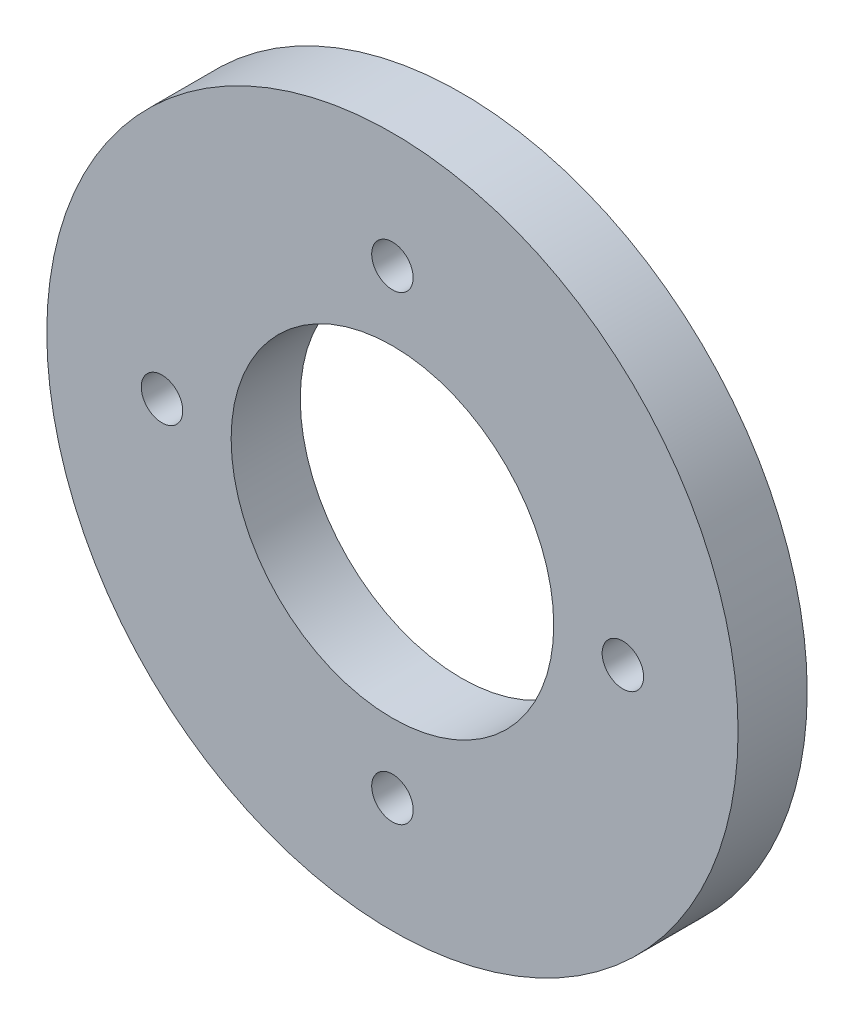
ISO-10303-21;
HEADER;
FILE_DESCRIPTION(('STEP AP214'),'2;1');
FILE_NAME('part.step','',(''),(''),'','','');
FILE_SCHEMA(('AUTOMOTIVE_DESIGN { 1 0 10303 214 1 1 1 1 }'));
ENDSEC;
DATA;
#1=APPLICATION_CONTEXT('core data for automotive mechanical design processes');
#2=APPLICATION_PROTOCOL_DEFINITION('international standard','automotive_design',2000,#1);
#3=PRODUCT_CONTEXT('',#1,'mechanical');
#4=PRODUCT('Part','Part','',(#3));
#5=PRODUCT_RELATED_PRODUCT_CATEGORY('part','',(#4));
#6=PRODUCT_DEFINITION_FORMATION('','',#4);
#7=PRODUCT_DEFINITION_CONTEXT('part definition',#1,'design');
#8=PRODUCT_DEFINITION('design','',#6,#7);
#9=PRODUCT_DEFINITION_SHAPE('','',#8);
#10=(LENGTH_UNIT() NAMED_UNIT(*) SI_UNIT(.MILLI.,.METRE.));
#11=(NAMED_UNIT(*) PLANE_ANGLE_UNIT() SI_UNIT($,.RADIAN.));
#12=(NAMED_UNIT(*) SI_UNIT($,.STERADIAN.) SOLID_ANGLE_UNIT());
#13=UNCERTAINTY_MEASURE_WITH_UNIT(LENGTH_MEASURE(1.E-05),#10,'distance_accuracy_value','');
#14=(GEOMETRIC_REPRESENTATION_CONTEXT(3) GLOBAL_UNCERTAINTY_ASSIGNED_CONTEXT((#13)) GLOBAL_UNIT_ASSIGNED_CONTEXT((#10,
#11,#12)) REPRESENTATION_CONTEXT('',''));
#15=CARTESIAN_POINT('',(0.,0.,0.));
#16=DIRECTION('',(0.,0.,1.));
#17=DIRECTION('',(1.,0.,0.));
#18=AXIS2_PLACEMENT_3D('',#15,#16,#17);
#19=CARTESIAN_POINT('',(0.,0.,3.));
#20=DIRECTION('',(0.,0.,1.));
#21=DIRECTION('',(1.,0.,0.));
#22=AXIS2_PLACEMENT_3D('',#19,#20,#21);
#23=PLANE('',#22);
#24=CARTESIAN_POINT('',(0.,0.,3.));
#25=DIRECTION('',(0.,0.,1.));
#26=DIRECTION('',(1.,0.,0.));
#27=AXIS2_PLACEMENT_3D('',#24,#25,#26);
#28=CIRCLE('',#27,7.);
#29=CARTESIAN_POINT('',(7.,0.,3.));
#30=VERTEX_POINT('',#29);
#31=EDGE_CURVE('E65',#30,#30,#28,.T.);
#32=ORIENTED_EDGE('',*,*,#31,.F.);
#33=EDGE_LOOP('',(#32));
#34=FACE_BOUND('',#33,.T.);
#35=CARTESIAN_POINT('',(0.,10.,3.));
#36=DIRECTION('',(0.,0.,1.));
#37=DIRECTION('',(1.,0.,0.));
#38=AXIS2_PLACEMENT_3D('',#35,#36,#37);
#39=CIRCLE('',#38,0.9);
#40=CARTESIAN_POINT('',(0.900000000000069,10.,3.));
#41=VERTEX_POINT('',#40);
#42=EDGE_CURVE('E53',#41,#41,#39,.T.);
#43=ORIENTED_EDGE('',*,*,#42,.F.);
#44=EDGE_LOOP('',(#43));
#45=FACE_BOUND('',#44,.T.);
#46=CARTESIAN_POINT('',(0.,-10.,3.));
#47=DIRECTION('',(0.,0.,1.));
#48=DIRECTION('',(1.,0.,0.));
#49=AXIS2_PLACEMENT_3D('',#46,#47,#48);
#50=CIRCLE('',#49,0.9);
#51=CARTESIAN_POINT('',(0.900000000000001,-10.,3.));
#52=VERTEX_POINT('',#51);
#53=EDGE_CURVE('E42',#52,#52,#50,.T.);
#54=ORIENTED_EDGE('',*,*,#53,.F.);
#55=EDGE_LOOP('',(#54));
#56=FACE_BOUND('',#55,.T.);
#57=CARTESIAN_POINT('',(0.,0.,3.));
#58=DIRECTION('',(0.,0.,1.));
#59=DIRECTION('',(1.,0.,0.));
#60=AXIS2_PLACEMENT_3D('',#57,#58,#59);
#61=CIRCLE('',#60,15.);
#62=CARTESIAN_POINT('',(15.,0.,3.));
#63=VERTEX_POINT('',#62);
#64=EDGE_CURVE('E10',#63,#63,#61,.T.);
#65=ORIENTED_EDGE('',*,*,#64,.T.);
#66=EDGE_LOOP('',(#65));
#67=FACE_BOUND('',#66,.T.);
#68=CARTESIAN_POINT('',(-10.,0.,3.));
#69=DIRECTION('',(0.,0.,1.));
#70=DIRECTION('',(1.,0.,0.));
#71=AXIS2_PLACEMENT_3D('',#68,#69,#70);
#72=CIRCLE('',#71,0.9);
#73=CARTESIAN_POINT('',(-9.1,0.,3.));
#74=VERTEX_POINT('',#73);
#75=EDGE_CURVE('E47',#74,#74,#72,.T.);
#76=ORIENTED_EDGE('',*,*,#75,.F.);
#77=EDGE_LOOP('',(#76));
#78=FACE_BOUND('',#77,.T.);
#79=CARTESIAN_POINT('',(10.,-1.05254516842123E-13,3.));
#80=DIRECTION('',(0.,0.,1.));
#81=DIRECTION('',(1.,0.,0.));
#82=AXIS2_PLACEMENT_3D('',#79,#80,#81);
#83=CIRCLE('',#82,0.9);
#84=CARTESIAN_POINT('',(10.9,-1.05254516842123E-13,3.));
#85=VERTEX_POINT('',#84);
#86=EDGE_CURVE('E59',#85,#85,#83,.T.);
#87=ORIENTED_EDGE('',*,*,#86,.F.);
#88=EDGE_LOOP('',(#87));
#89=FACE_BOUND('',#88,.T.);
#90=ADVANCED_FACE('F31',(#34,#45,#56,#67,#78,#89),#23,.T.);
#91=CARTESIAN_POINT('',(0.,0.,0.));
#92=DIRECTION('',(0.,0.,1.));
#93=DIRECTION('',(1.,0.,0.));
#94=AXIS2_PLACEMENT_3D('',#91,#92,#93);
#95=PLANE('',#94);
#96=CARTESIAN_POINT('',(0.,0.,0.));
#97=DIRECTION('',(0.,0.,-1.));
#98=DIRECTION('',(-1.,0.,0.));
#99=AXIS2_PLACEMENT_3D('',#96,#97,#98);
#100=CIRCLE('',#99,7.);
#101=CARTESIAN_POINT('',(-7.,0.,0.));
#102=VERTEX_POINT('',#101);
#103=EDGE_CURVE('E70',#102,#102,#100,.T.);
#104=ORIENTED_EDGE('',*,*,#103,.F.);
#105=EDGE_LOOP('',(#104));
#106=FACE_BOUND('',#105,.T.);
#107=CARTESIAN_POINT('',(0.,0.,0.));
#108=DIRECTION('',(0.,0.,1.));
#109=DIRECTION('',(1.,0.,0.));
#110=AXIS2_PLACEMENT_3D('',#107,#108,#109);
#111=CIRCLE('',#110,15.);
#112=CARTESIAN_POINT('',(15.,0.,0.));
#113=VERTEX_POINT('',#112);
#114=EDGE_CURVE('E35',#113,#113,#111,.T.);
#115=ORIENTED_EDGE('',*,*,#114,.F.);
#116=EDGE_LOOP('',(#115));
#117=FACE_BOUND('',#116,.T.);
#118=CARTESIAN_POINT('',(0.,-10.,0.));
#119=DIRECTION('',(0.,0.,1.));
#120=DIRECTION('',(1.,0.,0.));
#121=AXIS2_PLACEMENT_3D('',#118,#119,#120);
#122=CIRCLE('',#121,0.9);
#123=CARTESIAN_POINT('',(0.900000000000001,-10.,0.));
#124=VERTEX_POINT('',#123);
#125=EDGE_CURVE('E44',#124,#124,#122,.T.);
#126=ORIENTED_EDGE('',*,*,#125,.T.);
#127=EDGE_LOOP('',(#126));
#128=FACE_BOUND('',#127,.T.);
#129=CARTESIAN_POINT('',(-10.,0.,0.));
#130=DIRECTION('',(0.,0.,1.));
#131=DIRECTION('',(1.,0.,0.));
#132=AXIS2_PLACEMENT_3D('',#129,#130,#131);
#133=CIRCLE('',#132,0.9);
#134=CARTESIAN_POINT('',(-9.1,0.,0.));
#135=VERTEX_POINT('',#134);
#136=EDGE_CURVE('E50',#135,#135,#133,.T.);
#137=ORIENTED_EDGE('',*,*,#136,.T.);
#138=EDGE_LOOP('',(#137));
#139=FACE_BOUND('',#138,.T.);
#140=CARTESIAN_POINT('',(0.,10.,0.));
#141=DIRECTION('',(0.,0.,1.));
#142=DIRECTION('',(1.,0.,0.));
#143=AXIS2_PLACEMENT_3D('',#140,#141,#142);
#144=CIRCLE('',#143,0.9);
#145=CARTESIAN_POINT('',(0.900000000000069,10.,0.));
#146=VERTEX_POINT('',#145);
#147=EDGE_CURVE('E56',#146,#146,#144,.T.);
#148=ORIENTED_EDGE('',*,*,#147,.T.);
#149=EDGE_LOOP('',(#148));
#150=FACE_BOUND('',#149,.T.);
#151=CARTESIAN_POINT('',(10.,-1.05254516842123E-13,0.));
#152=DIRECTION('',(0.,0.,1.));
#153=DIRECTION('',(1.,0.,0.));
#154=AXIS2_PLACEMENT_3D('',#151,#152,#153);
#155=CIRCLE('',#154,0.9);
#156=CARTESIAN_POINT('',(10.9,-1.05254516842123E-13,0.));
#157=VERTEX_POINT('',#156);
#158=EDGE_CURVE('E62',#157,#157,#155,.T.);
#159=ORIENTED_EDGE('',*,*,#158,.T.);
#160=EDGE_LOOP('',(#159));
#161=FACE_BOUND('',#160,.T.);
#162=ADVANCED_FACE('F76',(#106,#117,#128,#139,#150,#161),#95,.F.);
#163=CARTESIAN_POINT('',(0.,0.,3.));
#164=DIRECTION('',(0.,0.,-1.));
#165=DIRECTION('',(-1.,0.,0.));
#166=AXIS2_PLACEMENT_3D('',#163,#164,#165);
#167=CYLINDRICAL_SURFACE('',#166,15.);
#168=ORIENTED_EDGE('',*,*,#64,.F.);
#169=EDGE_LOOP('',(#168));
#170=FACE_BOUND('',#169,.T.);
#171=ORIENTED_EDGE('',*,*,#114,.T.);
#172=EDGE_LOOP('',(#171));
#173=FACE_BOUND('',#172,.T.);
#174=ADVANCED_FACE('F33',(#170,#173),#167,.T.);
#175=CARTESIAN_POINT('',(0.,-10.,3.));
#176=DIRECTION('',(0.,0.,-1.));
#177=DIRECTION('',(-1.,0.,0.));
#178=AXIS2_PLACEMENT_3D('',#175,#176,#177);
#179=CYLINDRICAL_SURFACE('',#178,0.9);
#180=ORIENTED_EDGE('',*,*,#53,.T.);
#181=EDGE_LOOP('',(#180));
#182=FACE_BOUND('',#181,.T.);
#183=ORIENTED_EDGE('',*,*,#125,.F.);
#184=EDGE_LOOP('',(#183));
#185=FACE_BOUND('',#184,.T.);
#186=ADVANCED_FACE('F111',(#182,#185),#179,.F.);
#187=CARTESIAN_POINT('',(-10.,0.,3.));
#188=DIRECTION('',(0.,0.,-1.));
#189=DIRECTION('',(-1.,0.,0.));
#190=AXIS2_PLACEMENT_3D('',#187,#188,#189);
#191=CYLINDRICAL_SURFACE('',#190,0.9);
#192=ORIENTED_EDGE('',*,*,#75,.T.);
#193=EDGE_LOOP('',(#192));
#194=FACE_BOUND('',#193,.T.);
#195=ORIENTED_EDGE('',*,*,#136,.F.);
#196=EDGE_LOOP('',(#195));
#197=FACE_BOUND('',#196,.T.);
#198=ADVANCED_FACE('F100',(#194,#197),#191,.F.);
#199=CARTESIAN_POINT('',(0.,10.,3.));
#200=DIRECTION('',(0.,0.,-1.));
#201=DIRECTION('',(-1.,0.,0.));
#202=AXIS2_PLACEMENT_3D('',#199,#200,#201);
#203=CYLINDRICAL_SURFACE('',#202,0.9);
#204=ORIENTED_EDGE('',*,*,#42,.T.);
#205=EDGE_LOOP('',(#204));
#206=FACE_BOUND('',#205,.T.);
#207=ORIENTED_EDGE('',*,*,#147,.F.);
#208=EDGE_LOOP('',(#207));
#209=FACE_BOUND('',#208,.T.);
#210=ADVANCED_FACE('F91',(#206,#209),#203,.F.);
#211=CARTESIAN_POINT('',(10.,-1.05254516842123E-13,3.));
#212=DIRECTION('',(0.,0.,-1.));
#213=DIRECTION('',(-1.,0.,0.));
#214=AXIS2_PLACEMENT_3D('',#211,#212,#213);
#215=CYLINDRICAL_SURFACE('',#214,0.9);
#216=ORIENTED_EDGE('',*,*,#86,.T.);
#217=EDGE_LOOP('',(#216));
#218=FACE_BOUND('',#217,.T.);
#219=ORIENTED_EDGE('',*,*,#158,.F.);
#220=EDGE_LOOP('',(#219));
#221=FACE_BOUND('',#220,.T.);
#222=ADVANCED_FACE('F89',(#218,#221),#215,.F.);
#223=CARTESIAN_POINT('',(0.,0.,5.5));
#224=DIRECTION('',(0.,0.,-1.));
#225=DIRECTION('',(-1.,0.,0.));
#226=AXIS2_PLACEMENT_3D('',#223,#224,#225);
#227=CYLINDRICAL_SURFACE('',#226,7.);
#228=ORIENTED_EDGE('',*,*,#31,.T.);
#229=EDGE_LOOP('',(#228));
#230=FACE_BOUND('',#229,.T.);
#231=ORIENTED_EDGE('',*,*,#103,.T.);
#232=EDGE_LOOP('',(#231));
#233=FACE_BOUND('',#232,.T.);
#234=ADVANCED_FACE('F74',(#230,#233),#227,.F.);
#235=CLOSED_SHELL('',(#90,#162,#174,#186,#198,#210,#222,#234));
#236=MANIFOLD_SOLID_BREP('B2',#235);
#237=ADVANCED_BREP_SHAPE_REPRESENTATION('',(#18,#236),#14);
#238=SHAPE_DEFINITION_REPRESENTATION(#9,#237);
ENDSEC;
END-ISO-10303-21;
